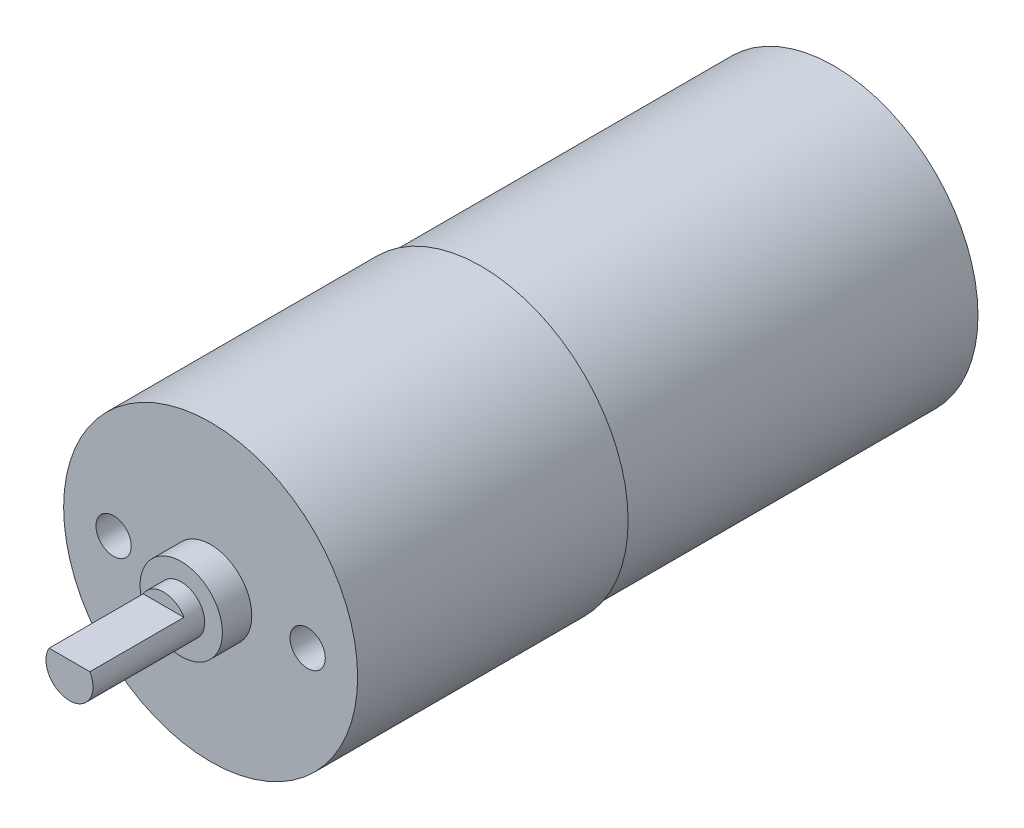
ISO-10303-21;
HEADER;
FILE_DESCRIPTION(('STEP AP214'),'2;1');
FILE_NAME('part.step','',(''),(''),'','','');
FILE_SCHEMA(('AUTOMOTIVE_DESIGN { 1 0 10303 214 1 1 1 1 }'));
ENDSEC;
DATA;
#1=APPLICATION_CONTEXT('core data for automotive mechanical design processes');
#2=APPLICATION_PROTOCOL_DEFINITION('international standard','automotive_design',2000,#1);
#3=PRODUCT_CONTEXT('',#1,'mechanical');
#4=PRODUCT('Part','Part','',(#3));
#5=PRODUCT_RELATED_PRODUCT_CATEGORY('part','',(#4));
#6=PRODUCT_DEFINITION_FORMATION('','',#4);
#7=PRODUCT_DEFINITION_CONTEXT('part definition',#1,'design');
#8=PRODUCT_DEFINITION('design','',#6,#7);
#9=PRODUCT_DEFINITION_SHAPE('','',#8);
#10=(LENGTH_UNIT() NAMED_UNIT(*) SI_UNIT(.MILLI.,.METRE.));
#11=(NAMED_UNIT(*) PLANE_ANGLE_UNIT() SI_UNIT($,.RADIAN.));
#12=(NAMED_UNIT(*) SI_UNIT($,.STERADIAN.) SOLID_ANGLE_UNIT());
#13=UNCERTAINTY_MEASURE_WITH_UNIT(LENGTH_MEASURE(1.E-05),#10,'distance_accuracy_value','');
#14=(GEOMETRIC_REPRESENTATION_CONTEXT(3) GLOBAL_UNCERTAINTY_ASSIGNED_CONTEXT((#13)) GLOBAL_UNIT_ASSIGNED_CONTEXT((#10,
#11,#12)) REPRESENTATION_CONTEXT('',''));
#15=CARTESIAN_POINT('',(0.,0.,0.));
#16=DIRECTION('',(0.,0.,1.));
#17=DIRECTION('',(1.,0.,0.));
#18=AXIS2_PLACEMENT_3D('',#15,#16,#17);
#19=CARTESIAN_POINT('',(0.,0.,0.));
#20=DIRECTION('',(0.,0.,1.));
#21=DIRECTION('',(1.,0.,0.));
#22=AXIS2_PLACEMENT_3D('',#19,#20,#21);
#23=PLANE('',#22);
#24=CARTESIAN_POINT('',(0.,0.,0.));
#25=DIRECTION('',(0.,0.,1.));
#26=DIRECTION('',(1.,0.,0.));
#27=AXIS2_PLACEMENT_3D('',#24,#25,#26);
#28=CIRCLE('',#27,12.25);
#29=CARTESIAN_POINT('',(12.25,0.,0.));
#30=VERTEX_POINT('',#29);
#31=EDGE_CURVE('E89',#30,#30,#28,.T.);
#32=ORIENTED_EDGE('',*,*,#31,.F.);
#33=EDGE_LOOP('',(#32));
#34=FACE_BOUND('',#33,.T.);
#35=CARTESIAN_POINT('',(0.,0.,0.));
#36=DIRECTION('',(0.,0.,1.));
#37=DIRECTION('',(1.,0.,0.));
#38=AXIS2_PLACEMENT_3D('',#35,#36,#37);
#39=CIRCLE('',#38,3.75);
#40=CARTESIAN_POINT('',(3.75,0.,0.));
#41=VERTEX_POINT('',#40);
#42=EDGE_CURVE('E120',#41,#41,#39,.F.);
#43=ORIENTED_EDGE('',*,*,#42,.F.);
#44=EDGE_LOOP('',(#43));
#45=FACE_BOUND('',#44,.T.);
#46=ADVANCED_FACE('F37',(#34,#45),#23,.F.);
#47=CARTESIAN_POINT('',(0.,0.,57.));
#48=DIRECTION('',(0.,0.,1.));
#49=DIRECTION('',(1.,0.,0.));
#50=AXIS2_PLACEMENT_3D('',#47,#48,#49);
#51=PLANE('',#50);
#52=CARTESIAN_POINT('',(0.,0.,57.));
#53=DIRECTION('',(0.,0.,1.));
#54=DIRECTION('',(1.,0.,0.));
#55=AXIS2_PLACEMENT_3D('',#52,#53,#54);
#56=CIRCLE('',#55,2.);
#57=CARTESIAN_POINT('',(1.73205080756888,1.,57.));
#58=VERTEX_POINT('',#57);
#59=CARTESIAN_POINT('',(-1.73205080756888,1.,57.));
#60=VERTEX_POINT('',#59);
#61=EDGE_CURVE('E71',#58,#60,#56,.T.);
#62=ORIENTED_EDGE('',*,*,#61,.T.);
#63=DIRECTION('',(1.,0.,0.));
#64=VECTOR('',#63,1.);
#65=CARTESIAN_POINT('',(0.,1.,57.));
#66=LINE('',#65,#64);
#67=EDGE_CURVE('E74',#60,#58,#66,.T.);
#68=ORIENTED_EDGE('',*,*,#67,.T.);
#69=EDGE_LOOP('',(#62,#68));
#70=FACE_BOUND('',#69,.T.);
#71=ADVANCED_FACE('F79',(#70),#51,.T.);
#72=CARTESIAN_POINT('',(0.,0.,55.5));
#73=DIRECTION('',(0.,0.,1.));
#74=DIRECTION('',(1.,0.,0.));
#75=AXIS2_PLACEMENT_3D('',#72,#73,#74);
#76=PLANE('',#75);
#77=CARTESIAN_POINT('',(0.,0.,55.5));
#78=DIRECTION('',(0.,0.,1.));
#79=DIRECTION('',(1.,0.,0.));
#80=AXIS2_PLACEMENT_3D('',#77,#78,#79);
#81=CIRCLE('',#80,3.5);
#82=CARTESIAN_POINT('',(3.5,0.,55.5));
#83=VERTEX_POINT('',#82);
#84=EDGE_CURVE('E83',#83,#83,#81,.T.);
#85=ORIENTED_EDGE('',*,*,#84,.T.);
#86=EDGE_LOOP('',(#85));
#87=FACE_BOUND('',#86,.T.);
#88=CARTESIAN_POINT('',(0.,0.,55.5));
#89=DIRECTION('',(0.,0.,1.));
#90=DIRECTION('',(1.,0.,0.));
#91=AXIS2_PLACEMENT_3D('',#88,#89,#90);
#92=CIRCLE('',#91,2.);
#93=CARTESIAN_POINT('',(2.,0.,55.5));
#94=VERTEX_POINT('',#93);
#95=EDGE_CURVE('E72',#94,#94,#92,.T.);
#96=ORIENTED_EDGE('',*,*,#95,.F.);
#97=EDGE_LOOP('',(#96));
#98=FACE_BOUND('',#97,.T.);
#99=ADVANCED_FACE('F153',(#87,#98),#76,.T.);
#100=CARTESIAN_POINT('',(0.,0.,53.));
#101=DIRECTION('',(0.,0.,1.));
#102=DIRECTION('',(1.,0.,0.));
#103=AXIS2_PLACEMENT_3D('',#100,#101,#102);
#104=PLANE('',#103);
#105=CARTESIAN_POINT('',(0.,0.,53.));
#106=DIRECTION('',(0.,0.,1.));
#107=DIRECTION('',(1.,0.,0.));
#108=AXIS2_PLACEMENT_3D('',#105,#106,#107);
#109=CIRCLE('',#108,12.5);
#110=CARTESIAN_POINT('',(12.5,0.,53.));
#111=VERTEX_POINT('',#110);
#112=EDGE_CURVE('E114',#111,#111,#109,.T.);
#113=ORIENTED_EDGE('',*,*,#112,.T.);
#114=EDGE_LOOP('',(#113));
#115=FACE_BOUND('',#114,.T.);
#116=CARTESIAN_POINT('',(-8.25,0.,53.));
#117=DIRECTION('',(0.,0.,1.));
#118=DIRECTION('',(1.,0.,0.));
#119=AXIS2_PLACEMENT_3D('',#116,#117,#118);
#120=CIRCLE('',#119,1.5);
#121=CARTESIAN_POINT('',(-6.75,0.,53.));
#122=VERTEX_POINT('',#121);
#123=EDGE_CURVE('E105',#122,#122,#120,.T.);
#124=ORIENTED_EDGE('',*,*,#123,.F.);
#125=EDGE_LOOP('',(#124));
#126=FACE_BOUND('',#125,.T.);
#127=CARTESIAN_POINT('',(8.25,0.,53.));
#128=DIRECTION('',(0.,0.,1.));
#129=DIRECTION('',(1.,0.,0.));
#130=AXIS2_PLACEMENT_3D('',#127,#128,#129);
#131=CIRCLE('',#130,1.5);
#132=CARTESIAN_POINT('',(9.75,0.,53.));
#133=VERTEX_POINT('',#132);
#134=EDGE_CURVE('E100',#133,#133,#131,.T.);
#135=ORIENTED_EDGE('',*,*,#134,.F.);
#136=EDGE_LOOP('',(#135));
#137=FACE_BOUND('',#136,.T.);
#138=CARTESIAN_POINT('',(0.,0.,53.));
#139=DIRECTION('',(0.,0.,1.));
#140=DIRECTION('',(1.,0.,0.));
#141=AXIS2_PLACEMENT_3D('',#138,#139,#140);
#142=CIRCLE('',#141,3.5);
#143=CARTESIAN_POINT('',(3.5,0.,53.));
#144=VERTEX_POINT('',#143);
#145=EDGE_CURVE('E80',#144,#144,#142,.T.);
#146=ORIENTED_EDGE('',*,*,#145,.F.);
#147=EDGE_LOOP('',(#146));
#148=FACE_BOUND('',#147,.T.);
#149=ADVANCED_FACE('F159',(#115,#126,#137,#148),#104,.T.);
#150=CARTESIAN_POINT('',(0.,0.,30.));
#151=DIRECTION('',(0.,0.,-1.));
#152=DIRECTION('',(-1.,0.,0.));
#153=AXIS2_PLACEMENT_3D('',#150,#151,#152);
#154=CYLINDRICAL_SURFACE('',#153,12.25);
#155=CARTESIAN_POINT('',(0.,0.,30.));
#156=DIRECTION('',(0.,0.,1.));
#157=DIRECTION('',(1.,0.,0.));
#158=AXIS2_PLACEMENT_3D('',#155,#156,#157);
#159=CIRCLE('',#158,12.25);
#160=CARTESIAN_POINT('',(12.25,0.,30.));
#161=VERTEX_POINT('',#160);
#162=EDGE_CURVE('E118',#161,#161,#159,.T.);
#163=ORIENTED_EDGE('',*,*,#162,.F.);
#164=EDGE_LOOP('',(#163));
#165=FACE_BOUND('',#164,.T.);
#166=ORIENTED_EDGE('',*,*,#31,.T.);
#167=EDGE_LOOP('',(#166));
#168=FACE_BOUND('',#167,.T.);
#169=ADVANCED_FACE('F128',(#165,#168),#154,.T.);
#170=CARTESIAN_POINT('',(0.,0.,30.));
#171=DIRECTION('',(0.,0.,1.));
#172=DIRECTION('',(1.,0.,0.));
#173=AXIS2_PLACEMENT_3D('',#170,#171,#172);
#174=PLANE('',#173);
#175=CARTESIAN_POINT('',(0.,0.,30.));
#176=DIRECTION('',(0.,0.,1.));
#177=DIRECTION('',(1.,0.,0.));
#178=AXIS2_PLACEMENT_3D('',#175,#176,#177);
#179=CIRCLE('',#178,12.5);
#180=CARTESIAN_POINT('',(12.5,0.,30.));
#181=VERTEX_POINT('',#180);
#182=EDGE_CURVE('E111',#181,#181,#179,.T.);
#183=ORIENTED_EDGE('',*,*,#182,.F.);
#184=EDGE_LOOP('',(#183));
#185=FACE_BOUND('',#184,.T.);
#186=ORIENTED_EDGE('',*,*,#162,.T.);
#187=EDGE_LOOP('',(#186));
#188=FACE_BOUND('',#187,.T.);
#189=ADVANCED_FACE('F184',(#185,#188),#174,.F.);
#190=CARTESIAN_POINT('',(0.,0.,53.));
#191=DIRECTION('',(0.,0.,-1.));
#192=DIRECTION('',(-1.,0.,0.));
#193=AXIS2_PLACEMENT_3D('',#190,#191,#192);
#194=CYLINDRICAL_SURFACE('',#193,12.5);
#195=ORIENTED_EDGE('',*,*,#112,.F.);
#196=EDGE_LOOP('',(#195));
#197=FACE_BOUND('',#196,.T.);
#198=ORIENTED_EDGE('',*,*,#182,.T.);
#199=EDGE_LOOP('',(#198));
#200=FACE_BOUND('',#199,.T.);
#201=ADVANCED_FACE('F179',(#197,#200),#194,.T.);
#202=CARTESIAN_POINT('',(-8.25,0.,48.));
#203=DIRECTION('',(0.,0.,1.));
#204=DIRECTION('',(1.,0.,0.));
#205=AXIS2_PLACEMENT_3D('',#202,#203,#204);
#206=CYLINDRICAL_SURFACE('',#205,1.5);
#207=CARTESIAN_POINT('',(-8.25,0.,48.));
#208=DIRECTION('',(0.,0.,1.));
#209=DIRECTION('',(1.,0.,0.));
#210=AXIS2_PLACEMENT_3D('',#207,#208,#209);
#211=CIRCLE('',#210,1.5);
#212=CARTESIAN_POINT('',(-6.75,0.,48.));
#213=VERTEX_POINT('',#212);
#214=EDGE_CURVE('E108',#213,#213,#211,.T.);
#215=ORIENTED_EDGE('',*,*,#214,.F.);
#216=EDGE_LOOP('',(#215));
#217=FACE_BOUND('',#216,.T.);
#218=ORIENTED_EDGE('',*,*,#123,.T.);
#219=EDGE_LOOP('',(#218));
#220=FACE_BOUND('',#219,.T.);
#221=ADVANCED_FACE('F175',(#217,#220),#206,.F.);
#222=CARTESIAN_POINT('',(0.,0.,48.));
#223=DIRECTION('',(0.,0.,1.));
#224=DIRECTION('',(1.,0.,0.));
#225=AXIS2_PLACEMENT_3D('',#222,#223,#224);
#226=PLANE('',#225);
#227=ORIENTED_EDGE('',*,*,#214,.T.);
#228=EDGE_LOOP('',(#227));
#229=FACE_BOUND('',#228,.T.);
#230=ADVANCED_FACE('F171',(#229),#226,.T.);
#231=CARTESIAN_POINT('',(8.25,0.,48.));
#232=DIRECTION('',(0.,0.,1.));
#233=DIRECTION('',(1.,0.,0.));
#234=AXIS2_PLACEMENT_3D('',#231,#232,#233);
#235=CYLINDRICAL_SURFACE('',#234,1.5);
#236=CARTESIAN_POINT('',(8.25,0.,48.));
#237=DIRECTION('',(0.,0.,1.));
#238=DIRECTION('',(1.,0.,0.));
#239=AXIS2_PLACEMENT_3D('',#236,#237,#238);
#240=CIRCLE('',#239,1.5);
#241=CARTESIAN_POINT('',(9.75,0.,48.));
#242=VERTEX_POINT('',#241);
#243=EDGE_CURVE('E102',#242,#242,#240,.T.);
#244=ORIENTED_EDGE('',*,*,#243,.F.);
#245=EDGE_LOOP('',(#244));
#246=FACE_BOUND('',#245,.T.);
#247=ORIENTED_EDGE('',*,*,#134,.T.);
#248=EDGE_LOOP('',(#247));
#249=FACE_BOUND('',#248,.T.);
#250=ADVANCED_FACE('F167',(#246,#249),#235,.F.);
#251=CARTESIAN_POINT('',(0.,0.,48.));
#252=DIRECTION('',(0.,0.,1.));
#253=DIRECTION('',(1.,0.,0.));
#254=AXIS2_PLACEMENT_3D('',#251,#252,#253);
#255=PLANE('',#254);
#256=ORIENTED_EDGE('',*,*,#243,.T.);
#257=EDGE_LOOP('',(#256));
#258=FACE_BOUND('',#257,.T.);
#259=ADVANCED_FACE('F163',(#258),#255,.T.);
#260=CARTESIAN_POINT('',(0.,0.,55.5));
#261=DIRECTION('',(0.,0.,-1.));
#262=DIRECTION('',(-1.,0.,0.));
#263=AXIS2_PLACEMENT_3D('',#260,#261,#262);
#264=CYLINDRICAL_SURFACE('',#263,3.5);
#265=ORIENTED_EDGE('',*,*,#84,.F.);
#266=EDGE_LOOP('',(#265));
#267=FACE_BOUND('',#266,.T.);
#268=ORIENTED_EDGE('',*,*,#145,.T.);
#269=EDGE_LOOP('',(#268));
#270=FACE_BOUND('',#269,.T.);
#271=ADVANCED_FACE('F156',(#267,#270),#264,.T.);
#272=CARTESIAN_POINT('',(0.,0.,57.));
#273=DIRECTION('',(0.,0.,-1.));
#274=DIRECTION('',(-1.,0.,0.));
#275=AXIS2_PLACEMENT_3D('',#272,#273,#274);
#276=CYLINDRICAL_SURFACE('',#275,2.);
#277=ORIENTED_EDGE('',*,*,#61,.F.);
#278=DIRECTION('',(0.,0.,-1.));
#279=VECTOR('',#278,1.);
#280=CARTESIAN_POINT('',(1.73205080756888,1.,65.));
#281=LINE('',#280,#279);
#282=CARTESIAN_POINT('',(1.73205080756888,1.,65.));
#283=VERTEX_POINT('',#282);
#284=EDGE_CURVE('E52',#283,#58,#281,.T.);
#285=ORIENTED_EDGE('',*,*,#284,.F.);
#286=CARTESIAN_POINT('',(0.,0.,65.));
#287=DIRECTION('',(0.,0.,1.));
#288=DIRECTION('',(1.,0.,0.));
#289=AXIS2_PLACEMENT_3D('',#286,#287,#288);
#290=CIRCLE('',#289,2.);
#291=CARTESIAN_POINT('',(-1.73205080756888,1.,65.));
#292=VERTEX_POINT('',#291);
#293=EDGE_CURVE('E60',#292,#283,#290,.T.);
#294=ORIENTED_EDGE('',*,*,#293,.F.);
#295=DIRECTION('',(0.,0.,-1.));
#296=VECTOR('',#295,1.);
#297=CARTESIAN_POINT('',(-1.73205080756888,1.,65.));
#298=LINE('',#297,#296);
#299=EDGE_CURVE('E67',#292,#60,#298,.T.);
#300=ORIENTED_EDGE('',*,*,#299,.T.);
#301=EDGE_LOOP('',(#277,#285,#294,#300));
#302=FACE_BOUND('',#301,.T.);
#303=ORIENTED_EDGE('',*,*,#95,.T.);
#304=EDGE_LOOP('',(#303));
#305=FACE_BOUND('',#304,.T.);
#306=ADVANCED_FACE('F68',(#302,#305),#276,.T.);
#307=CARTESIAN_POINT('',(0.,1.,65.));
#308=DIRECTION('',(0.,1.,0.));
#309=DIRECTION('',(0.,0.,1.));
#310=AXIS2_PLACEMENT_3D('',#307,#308,#309);
#311=PLANE('',#310);
#312=ORIENTED_EDGE('',*,*,#67,.F.);
#313=ORIENTED_EDGE('',*,*,#299,.F.);
#314=DIRECTION('',(1.,0.,0.));
#315=VECTOR('',#314,1.);
#316=CARTESIAN_POINT('',(0.,1.,65.));
#317=LINE('',#316,#315);
#318=EDGE_CURVE('E77',#292,#283,#317,.T.);
#319=ORIENTED_EDGE('',*,*,#318,.T.);
#320=ORIENTED_EDGE('',*,*,#284,.T.);
#321=EDGE_LOOP('',(#312,#313,#319,#320));
#322=FACE_BOUND('',#321,.T.);
#323=ADVANCED_FACE('F75',(#322),#311,.T.);
#324=CARTESIAN_POINT('',(0.,0.,65.));
#325=DIRECTION('',(0.,0.,1.));
#326=DIRECTION('',(1.,0.,0.));
#327=AXIS2_PLACEMENT_3D('',#324,#325,#326);
#328=PLANE('',#327);
#329=ORIENTED_EDGE('',*,*,#318,.F.);
#330=ORIENTED_EDGE('',*,*,#293,.T.);
#331=EDGE_LOOP('',(#329,#330));
#332=FACE_BOUND('',#331,.T.);
#333=ADVANCED_FACE('F138',(#332),#328,.T.);
#334=CARTESIAN_POINT('',(0.,0.,-2.));
#335=DIRECTION('',(0.,0.,1.));
#336=DIRECTION('',(1.,0.,0.));
#337=AXIS2_PLACEMENT_3D('',#334,#335,#336);
#338=CYLINDRICAL_SURFACE('',#337,3.75);
#339=CARTESIAN_POINT('',(0.,0.,-1.));
#340=DIRECTION('',(0.,0.,-1.));
#341=DIRECTION('',(-1.,0.,0.));
#342=AXIS2_PLACEMENT_3D('',#339,#340,#341);
#343=CIRCLE('',#342,3.75);
#344=CARTESIAN_POINT('',(-3.75,0.,-1.));
#345=VERTEX_POINT('',#344);
#346=EDGE_CURVE('E12',#345,#345,#343,.F.);
#347=ORIENTED_EDGE('',*,*,#346,.T.);
#348=EDGE_LOOP('',(#347));
#349=FACE_BOUND('',#348,.T.);
#350=ORIENTED_EDGE('',*,*,#42,.T.);
#351=EDGE_LOOP('',(#350));
#352=FACE_BOUND('',#351,.T.);
#353=ADVANCED_FACE('F135',(#349,#352),#338,.T.);
#354=CARTESIAN_POINT('',(0.,0.,-2.));
#355=DIRECTION('',(0.,0.,-1.));
#356=DIRECTION('',(-1.,0.,0.));
#357=AXIS2_PLACEMENT_3D('',#354,#355,#356);
#358=PLANE('',#357);
#359=CARTESIAN_POINT('',(0.,0.,-2.));
#360=DIRECTION('',(0.,0.,-1.));
#361=DIRECTION('',(-1.,0.,0.));
#362=AXIS2_PLACEMENT_3D('',#359,#360,#361);
#363=CIRCLE('',#362,2.75);
#364=CARTESIAN_POINT('',(-2.75,0.,-2.));
#365=VERTEX_POINT('',#364);
#366=EDGE_CURVE('E45',#365,#365,#363,.T.);
#367=ORIENTED_EDGE('',*,*,#366,.T.);
#368=EDGE_LOOP('',(#367));
#369=FACE_BOUND('',#368,.T.);
#370=ADVANCED_FACE('F137',(#369),#358,.T.);
#371=CARTESIAN_POINT('',(0.,0.,-1.));
#372=DIRECTION('',(0.,0.,-1.));
#373=DIRECTION('',(-1.,0.,0.));
#374=AXIS2_PLACEMENT_3D('',#371,#372,#373);
#375=TOROIDAL_SURFACE('',#374,2.75,1.);
#376=ORIENTED_EDGE('',*,*,#346,.F.);
#377=EDGE_LOOP('',(#376));
#378=FACE_BOUND('',#377,.T.);
#379=ORIENTED_EDGE('',*,*,#366,.F.);
#380=EDGE_LOOP('',(#379));
#381=FACE_BOUND('',#380,.T.);
#382=ADVANCED_FACE('F39',(#378,#381),#375,.T.);
#383=CLOSED_SHELL('',(#46,#71,#99,#149,#169,#189,#201,#221,#230,#250,#259,#271,#306,#323,#333,
#353,#370,#382));
#384=MANIFOLD_SOLID_BREP('B2',#383);
#385=ADVANCED_BREP_SHAPE_REPRESENTATION('',(#18,#384),#14);
#386=SHAPE_DEFINITION_REPRESENTATION(#9,#385);
ENDSEC;
END-ISO-10303-21;
